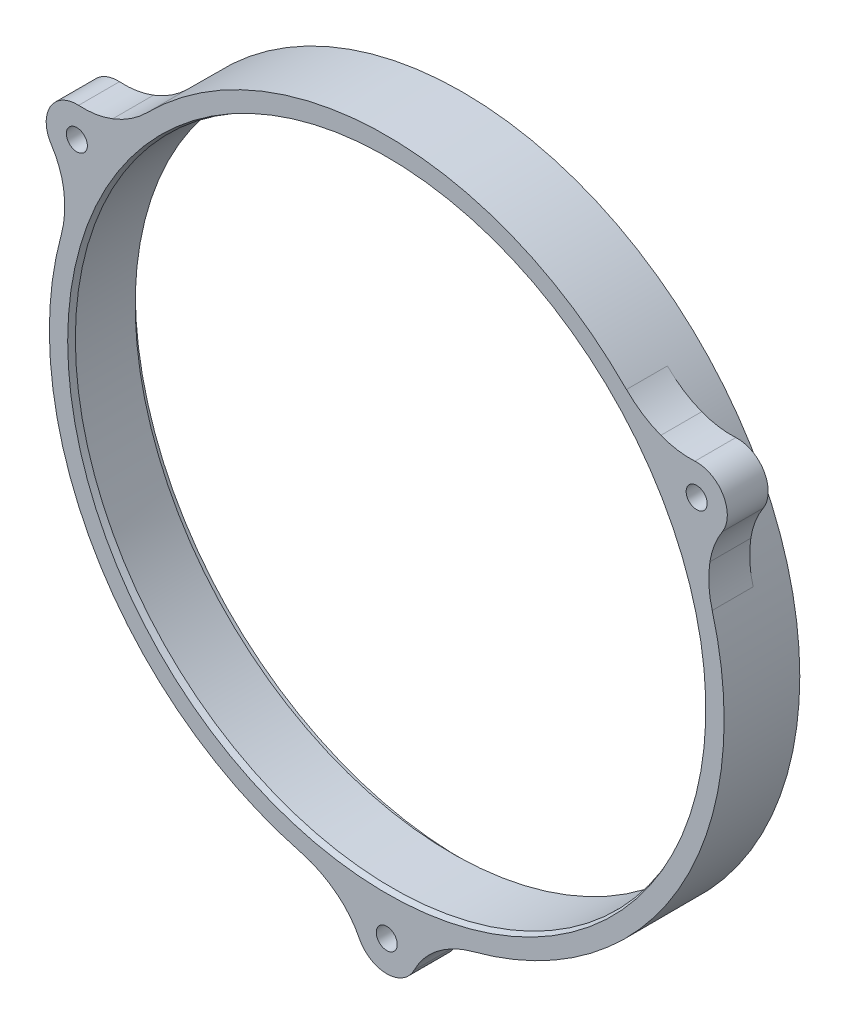
ISO-10303-21;
HEADER;
FILE_DESCRIPTION(('STEP AP214'),'2;1');
FILE_NAME('part.step','',(''),(''),'','','');
FILE_SCHEMA(('AUTOMOTIVE_DESIGN { 1 0 10303 214 1 1 1 1 }'));
ENDSEC;
DATA;
#1=APPLICATION_CONTEXT('core data for automotive mechanical design processes');
#2=APPLICATION_PROTOCOL_DEFINITION('international standard','automotive_design',2000,#1);
#3=PRODUCT_CONTEXT('',#1,'mechanical');
#4=PRODUCT('Part','Part','',(#3));
#5=PRODUCT_RELATED_PRODUCT_CATEGORY('part','',(#4));
#6=PRODUCT_DEFINITION_FORMATION('','',#4);
#7=PRODUCT_DEFINITION_CONTEXT('part definition',#1,'design');
#8=PRODUCT_DEFINITION('design','',#6,#7);
#9=PRODUCT_DEFINITION_SHAPE('','',#8);
#10=(LENGTH_UNIT() NAMED_UNIT(*) SI_UNIT(.MILLI.,.METRE.));
#11=(NAMED_UNIT(*) PLANE_ANGLE_UNIT() SI_UNIT($,.RADIAN.));
#12=(NAMED_UNIT(*) SI_UNIT($,.STERADIAN.) SOLID_ANGLE_UNIT());
#13=UNCERTAINTY_MEASURE_WITH_UNIT(LENGTH_MEASURE(1.E-05),#10,'distance_accuracy_value','');
#14=(GEOMETRIC_REPRESENTATION_CONTEXT(3) GLOBAL_UNCERTAINTY_ASSIGNED_CONTEXT((#13)) GLOBAL_UNIT_ASSIGNED_CONTEXT((#10,
#11,#12)) REPRESENTATION_CONTEXT('',''));
#15=CARTESIAN_POINT('',(0.,0.,0.));
#16=DIRECTION('',(0.,0.,1.));
#17=DIRECTION('',(1.,0.,0.));
#18=AXIS2_PLACEMENT_3D('',#15,#16,#17);
#19=CARTESIAN_POINT('',(0.,98.4504,0.));
#20=DIRECTION('',(0.,0.,-1.));
#21=DIRECTION('',(-1.,0.,0.));
#22=AXIS2_PLACEMENT_3D('',#19,#20,#21);
#23=PLANE('',#22);
#24=CARTESIAN_POINT('',(0.,0.,0.));
#25=DIRECTION('',(0.,0.,-1.));
#26=DIRECTION('',(-1.,0.,0.));
#27=AXIS2_PLACEMENT_3D('',#24,#25,#26);
#28=CIRCLE('',#27,99.0854);
#29=CARTESIAN_POINT('',(-99.0854,0.,0.));
#30=VERTEX_POINT('',#29);
#31=EDGE_CURVE('E11',#30,#30,#28,.T.);
#32=ORIENTED_EDGE('',*,*,#31,.T.);
#33=EDGE_LOOP('',(#32));
#34=FACE_BOUND('',#33,.T.);
#35=CARTESIAN_POINT('',(0.,-111.125,0.));
#36=DIRECTION('',(0.,0.,1.));
#37=DIRECTION('',(1.,0.,0.));
#38=AXIS2_PLACEMENT_3D('',#35,#36,#37);
#39=CIRCLE('',#38,3.2639);
#40=CARTESIAN_POINT('',(3.2639,-111.125,0.));
#41=VERTEX_POINT('',#40);
#42=EDGE_CURVE('E310',#41,#41,#39,.T.);
#43=ORIENTED_EDGE('',*,*,#42,.F.);
#44=EDGE_LOOP('',(#43));
#45=FACE_BOUND('',#44,.T.);
#46=CARTESIAN_POINT('',(-96.2370729955455,55.5625000000004,0.));
#47=DIRECTION('',(0.,0.,1.));
#48=DIRECTION('',(1.,0.,0.));
#49=AXIS2_PLACEMENT_3D('',#46,#47,#48);
#50=CIRCLE('',#49,3.2639);
#51=CARTESIAN_POINT('',(-92.9731729955455,55.5625000000004,0.));
#52=VERTEX_POINT('',#51);
#53=EDGE_CURVE('E231',#52,#52,#50,.T.);
#54=ORIENTED_EDGE('',*,*,#53,.F.);
#55=EDGE_LOOP('',(#54));
#56=FACE_BOUND('',#55,.T.);
#57=CARTESIAN_POINT('',(0.,0.,0.));
#58=DIRECTION('',(0.,0.,1.));
#59=DIRECTION('',(1.,0.,0.));
#60=AXIS2_PLACEMENT_3D('',#57,#58,#59);
#61=CIRCLE('',#60,104.775);
#62=CARTESIAN_POINT('',(-101.071009975213,27.6125255561757,0.));
#63=VERTEX_POINT('',#62);
#64=CARTESIAN_POINT('',(-26.6223563933117,-101.336325002772,0.));
#65=VERTEX_POINT('',#64);
#66=EDGE_CURVE('E302',#63,#65,#61,.T.);
#67=ORIENTED_EDGE('',*,*,#66,.T.);
#68=CARTESIAN_POINT('',(-34.3670418895478,-130.815983185397,0.));
#69=DIRECTION('',(0.,0.,-1.));
#70=DIRECTION('',(-0.500000000000004,0.866025403784436,0.));
#71=AXIS2_PLACEMENT_3D('',#68,#69,#70);
#72=CIRCLE('',#71,30.48);
#73=CARTESIAN_POINT('',(-15.24,-107.084428905167,0.));
#74=VERTEX_POINT('',#73);
#75=EDGE_CURVE('E219',#65,#74,#72,.T.);
#76=ORIENTED_EDGE('',*,*,#75,.T.);
#77=CARTESIAN_POINT('',(-31.1792015746232,-126.860724138692,0.));
#78=DIRECTION('',(0.,0.,-1.));
#79=DIRECTION('',(0.500000000000004,-0.866025403784436,0.));
#80=AXIS2_PLACEMENT_3D('',#77,#78,#79);
#81=CIRCLE('',#80,25.4);
#82=CARTESIAN_POINT('',(-8.50341861126089,-115.416561128734,0.));
#83=VERTEX_POINT('',#82);
#84=EDGE_CURVE('E222',#74,#83,#81,.T.);
#85=ORIENTED_EDGE('',*,*,#84,.T.);
#86=CARTESIAN_POINT('',(0.,-111.125,0.));
#87=DIRECTION('',(0.,0.,1.));
#88=DIRECTION('',(-0.500000000000004,0.866025403784436,0.));
#89=AXIS2_PLACEMENT_3D('',#86,#87,#88);
#90=CIRCLE('',#89,9.525);
#91=CARTESIAN_POINT('',(8.50341861126084,-115.416561128734,0.));
#92=VERTEX_POINT('',#91);
#93=EDGE_CURVE('E225',#83,#92,#90,.T.);
#94=ORIENTED_EDGE('',*,*,#93,.T.);
#95=CARTESIAN_POINT('',(31.1792015746231,-126.860724138692,0.));
#96=DIRECTION('',(0.,0.,-1.));
#97=DIRECTION('',(-0.500000000000004,0.866025403784436,0.));
#98=AXIS2_PLACEMENT_3D('',#95,#96,#97);
#99=CIRCLE('',#98,25.4);
#100=CARTESIAN_POINT('',(15.24,-107.084428905167,0.));
#101=VERTEX_POINT('',#100);
#102=EDGE_CURVE('E202',#92,#101,#99,.T.);
#103=ORIENTED_EDGE('',*,*,#102,.T.);
#104=CARTESIAN_POINT('',(34.3670418895478,-130.815983185397,0.));
#105=DIRECTION('',(0.,0.,-1.));
#106=DIRECTION('',(0.500000000000004,-0.866025403784436,0.));
#107=AXIS2_PLACEMENT_3D('',#104,#105,#106);
#108=CIRCLE('',#107,30.48);
#109=CARTESIAN_POINT('',(26.6223563933116,-101.336325002772,0.));
#110=VERTEX_POINT('',#109);
#111=EDGE_CURVE('E60',#101,#110,#108,.T.);
#112=ORIENTED_EDGE('',*,*,#111,.T.);
#113=CARTESIAN_POINT('',(101.071009975213,27.6125255561757,0.));
#114=VERTEX_POINT('',#113);
#115=EDGE_CURVE('E305',#110,#114,#61,.T.);
#116=ORIENTED_EDGE('',*,*,#115,.T.);
#117=CARTESIAN_POINT('',(130.473485604366,35.6452602634267,0.));
#118=DIRECTION('',(0.,0.,-1.));
#119=DIRECTION('',(-0.499999999999992,-0.866025403784443,0.));
#120=AXIS2_PLACEMENT_3D('',#117,#118,#119);
#121=CIRCLE('',#120,30.48);
#122=CARTESIAN_POINT('',(100.357835781623,40.3439872989093,0.));
#123=VERTEX_POINT('',#122);
#124=EDGE_CURVE('E445',#114,#123,#121,.T.);
#125=ORIENTED_EDGE('',*,*,#124,.T.);
#126=CARTESIAN_POINT('',(125.454210633908,36.4283814360072,0.));
#127=DIRECTION('',(0.,0.,-1.));
#128=DIRECTION('',(0.499999999999992,0.866025403784443,0.));
#129=AXIS2_PLACEMENT_3D('',#126,#127,#128);
#130=CIRCLE('',#129,25.4);
#131=CARTESIAN_POINT('',(104.205383260554,50.3441040280023,0.));
#132=VERTEX_POINT('',#131);
#133=EDGE_CURVE('E448',#123,#132,#130,.T.);
#134=ORIENTED_EDGE('',*,*,#133,.T.);
#135=CARTESIAN_POINT('',(96.2370729955455,55.5625000000004,0.));
#136=DIRECTION('',(0.,0.,1.));
#137=DIRECTION('',(-0.499999999999992,-0.866025403784443,0.));
#138=AXIS2_PLACEMENT_3D('',#135,#136,#137);
#139=CIRCLE('',#138,9.525);
#140=CARTESIAN_POINT('',(95.7019646492927,65.0724571007328,0.));
#141=VERTEX_POINT('',#140);
#142=EDGE_CURVE('E451',#132,#141,#139,.T.);
#143=ORIENTED_EDGE('',*,*,#142,.T.);
#144=CARTESIAN_POINT('',(94.2750090592851,90.4323427026859,0.));
#145=DIRECTION('',(0.,0.,-1.));
#146=DIRECTION('',(-0.499999999999992,-0.866025403784443,0.));
#147=AXIS2_PLACEMENT_3D('',#144,#145,#146);
#148=CIRCLE('',#147,25.4);
#149=CARTESIAN_POINT('',(85.1178357816233,66.7404416062589,0.));
#150=VERTEX_POINT('',#149);
#151=EDGE_CURVE('E184',#141,#150,#148,.T.);
#152=ORIENTED_EDGE('',*,*,#151,.T.);
#153=CARTESIAN_POINT('',(96.1064437148175,95.1707229219713,0.));
#154=DIRECTION('',(0.,0.,-1.));
#155=DIRECTION('',(0.499999999999992,0.866025403784443,0.));
#156=AXIS2_PLACEMENT_3D('',#153,#154,#155);
#157=CIRCLE('',#156,30.48);
#158=CARTESIAN_POINT('',(74.4486535819009,73.7237994465974,0.));
#159=VERTEX_POINT('',#158);
#160=EDGE_CURVE('E53',#150,#159,#157,.T.);
#161=ORIENTED_EDGE('',*,*,#160,.T.);
#162=CARTESIAN_POINT('',(-74.4486535819008,73.7237994465975,0.));
#163=VERTEX_POINT('',#162);
#164=EDGE_CURVE('E188',#159,#163,#61,.T.);
#165=ORIENTED_EDGE('',*,*,#164,.T.);
#166=CARTESIAN_POINT('',(-96.1064437148174,95.1707229219713,0.));
#167=DIRECTION('',(0.,0.,-1.));
#168=DIRECTION('',(1.,0.,0.));
#169=AXIS2_PLACEMENT_3D('',#166,#167,#168);
#170=CIRCLE('',#169,30.48);
#171=CARTESIAN_POINT('',(-85.1178357816233,66.740441606259,0.));
#172=VERTEX_POINT('',#171);
#173=EDGE_CURVE('E267',#163,#172,#170,.T.);
#174=ORIENTED_EDGE('',*,*,#173,.T.);
#175=CARTESIAN_POINT('',(-94.2750090592851,90.4323427026859,0.));
#176=DIRECTION('',(0.,0.,-1.));
#177=DIRECTION('',(-1.,0.,0.));
#178=AXIS2_PLACEMENT_3D('',#175,#176,#177);
#179=CIRCLE('',#178,25.4);
#180=CARTESIAN_POINT('',(-95.7019646492926,65.0724571007329,0.));
#181=VERTEX_POINT('',#180);
#182=EDGE_CURVE('E270',#172,#181,#179,.T.);
#183=ORIENTED_EDGE('',*,*,#182,.T.);
#184=CARTESIAN_POINT('',(-96.2370729955455,55.5625000000005,0.));
#185=DIRECTION('',(0.,0.,1.));
#186=DIRECTION('',(1.,0.,0.));
#187=AXIS2_PLACEMENT_3D('',#184,#185,#186);
#188=CIRCLE('',#187,9.525);
#189=CARTESIAN_POINT('',(-104.205383260554,50.3441040280023,0.));
#190=VERTEX_POINT('',#189);
#191=EDGE_CURVE('E273',#181,#190,#188,.T.);
#192=ORIENTED_EDGE('',*,*,#191,.T.);
#193=CARTESIAN_POINT('',(-125.454210633908,36.4283814360072,0.));
#194=DIRECTION('',(0.,0.,-1.));
#195=DIRECTION('',(1.,0.,0.));
#196=AXIS2_PLACEMENT_3D('',#193,#194,#195);
#197=CIRCLE('',#196,25.4);
#198=CARTESIAN_POINT('',(-100.357835781623,40.3439872989094,0.));
#199=VERTEX_POINT('',#198);
#200=EDGE_CURVE('E249',#190,#199,#197,.T.);
#201=ORIENTED_EDGE('',*,*,#200,.T.);
#202=CARTESIAN_POINT('',(-130.473485604366,35.6452602634268,0.));
#203=DIRECTION('',(0.,0.,-1.));
#204=DIRECTION('',(-1.,0.,0.));
#205=AXIS2_PLACEMENT_3D('',#202,#203,#204);
#206=CIRCLE('',#205,30.48);
#207=EDGE_CURVE('E265',#199,#63,#206,.T.);
#208=ORIENTED_EDGE('',*,*,#207,.T.);
#209=EDGE_LOOP('',(#67,#76,#85,#94,#103,#112,#116,#125,#134,#143,#152,#161,#165,#174,#183,#192,
#201,#208));
#210=FACE_BOUND('',#209,.T.);
#211=CARTESIAN_POINT('',(96.2370729955455,55.5625000000004,0.));
#212=DIRECTION('',(0.,0.,1.));
#213=DIRECTION('',(1.,0.,0.));
#214=AXIS2_PLACEMENT_3D('',#211,#212,#213);
#215=CIRCLE('',#214,3.2639);
#216=CARTESIAN_POINT('',(99.5009729955455,55.5625000000004,0.));
#217=VERTEX_POINT('',#216);
#218=EDGE_CURVE('E311',#217,#217,#215,.T.);
#219=ORIENTED_EDGE('',*,*,#218,.F.);
#220=EDGE_LOOP('',(#219));
#221=FACE_BOUND('',#220,.T.);
#222=ADVANCED_FACE('F38',(#34,#45,#56,#210,#221),#23,.F.);
#223=CARTESIAN_POINT('',(0.,0.,0.));
#224=DIRECTION('',(0.,0.,1.));
#225=DIRECTION('',(1.,0.,0.));
#226=AXIS2_PLACEMENT_3D('',#223,#224,#225);
#227=CYLINDRICAL_SURFACE('',#226,104.775);
#228=CARTESIAN_POINT('',(0.,0.,-23.495));
#229=DIRECTION('',(0.,0.,1.));
#230=DIRECTION('',(1.,0.,0.));
#231=AXIS2_PLACEMENT_3D('',#228,#229,#230);
#232=CIRCLE('',#231,104.775);
#233=CARTESIAN_POINT('',(104.775,0.,-23.495));
#234=VERTEX_POINT('',#233);
#235=EDGE_CURVE('E299',#234,#234,#232,.T.);
#236=ORIENTED_EDGE('',*,*,#235,.T.);
#237=EDGE_LOOP('',(#236));
#238=FACE_BOUND('',#237,.T.);
#239=DIRECTION('',(0.,0.,1.));
#240=VECTOR('',#239,1.);
#241=CARTESIAN_POINT('',(74.4486535819009,73.7237994465975,-12.7));
#242=LINE('',#241,#240);
#243=CARTESIAN_POINT('',(74.4486535819009,73.7237994465975,-12.7));
#244=VERTEX_POINT('',#243);
#245=EDGE_CURVE('E181',#244,#159,#242,.T.);
#246=ORIENTED_EDGE('',*,*,#245,.F.);
#247=CARTESIAN_POINT('',(0.,0.,-12.7));
#248=DIRECTION('',(0.,0.,-1.));
#249=DIRECTION('',(-0.499999999999992,-0.866025403784443,0.));
#250=AXIS2_PLACEMENT_3D('',#247,#248,#249);
#251=CIRCLE('',#250,104.775);
#252=CARTESIAN_POINT('',(101.071009975213,27.6125255561757,-12.7));
#253=VERTEX_POINT('',#252);
#254=EDGE_CURVE('E166',#244,#253,#251,.T.);
#255=ORIENTED_EDGE('',*,*,#254,.T.);
#256=DIRECTION('',(0.,0.,1.));
#257=VECTOR('',#256,1.);
#258=CARTESIAN_POINT('',(101.071009975213,27.6125255561757,-12.7));
#259=LINE('',#258,#257);
#260=EDGE_CURVE('E189',#253,#114,#259,.T.);
#261=ORIENTED_EDGE('',*,*,#260,.T.);
#262=ORIENTED_EDGE('',*,*,#115,.F.);
#263=DIRECTION('',(0.,0.,1.));
#264=VECTOR('',#263,1.);
#265=CARTESIAN_POINT('',(26.6223563933117,-101.336325002772,-12.7));
#266=LINE('',#265,#264);
#267=CARTESIAN_POINT('',(26.6223563933117,-101.336325002772,-12.7));
#268=VERTEX_POINT('',#267);
#269=EDGE_CURVE('E217',#268,#110,#266,.T.);
#270=ORIENTED_EDGE('',*,*,#269,.F.);
#271=CARTESIAN_POINT('',(0.,0.,-12.7));
#272=DIRECTION('',(0.,0.,-1.));
#273=DIRECTION('',(-0.500000000000004,0.866025403784436,0.));
#274=AXIS2_PLACEMENT_3D('',#271,#272,#273);
#275=CIRCLE('',#274,104.775);
#276=CARTESIAN_POINT('',(-26.6223563933117,-101.336325002772,-12.7));
#277=VERTEX_POINT('',#276);
#278=EDGE_CURVE('E201',#268,#277,#275,.T.);
#279=ORIENTED_EDGE('',*,*,#278,.T.);
#280=DIRECTION('',(0.,0.,1.));
#281=VECTOR('',#280,1.);
#282=CARTESIAN_POINT('',(-26.6223563933117,-101.336325002772,-12.7));
#283=LINE('',#282,#281);
#284=EDGE_CURVE('E238',#277,#65,#283,.T.);
#285=ORIENTED_EDGE('',*,*,#284,.T.);
#286=ORIENTED_EDGE('',*,*,#66,.F.);
#287=DIRECTION('',(0.,0.,1.));
#288=VECTOR('',#287,1.);
#289=CARTESIAN_POINT('',(-101.071009975213,27.6125255561757,-12.7));
#290=LINE('',#289,#288);
#291=CARTESIAN_POINT('',(-101.071009975213,27.6125255561757,-12.7));
#292=VERTEX_POINT('',#291);
#293=EDGE_CURVE('E264',#292,#63,#290,.T.);
#294=ORIENTED_EDGE('',*,*,#293,.F.);
#295=CARTESIAN_POINT('',(0.,0.,-12.7));
#296=DIRECTION('',(0.,0.,-1.));
#297=DIRECTION('',(1.,0.,0.));
#298=AXIS2_PLACEMENT_3D('',#295,#296,#297);
#299=CIRCLE('',#298,104.775);
#300=CARTESIAN_POINT('',(-74.4486535819008,73.7237994465975,-12.7));
#301=VERTEX_POINT('',#300);
#302=EDGE_CURVE('E248',#292,#301,#299,.T.);
#303=ORIENTED_EDGE('',*,*,#302,.T.);
#304=DIRECTION('',(0.,0.,1.));
#305=VECTOR('',#304,1.);
#306=CARTESIAN_POINT('',(-74.4486535819008,73.7237994465975,-12.7));
#307=LINE('',#306,#305);
#308=EDGE_CURVE('E287',#301,#163,#307,.T.);
#309=ORIENTED_EDGE('',*,*,#308,.T.);
#310=ORIENTED_EDGE('',*,*,#164,.F.);
#311=EDGE_LOOP('',(#246,#255,#261,#262,#270,#279,#285,#286,#294,#303,#309,#310));
#312=FACE_BOUND('',#311,.T.);
#313=ADVANCED_FACE('F186',(#238,#312),#227,.T.);
#314=CARTESIAN_POINT('',(0.,104.775,-23.495));
#315=DIRECTION('',(0.,0.,1.));
#316=DIRECTION('',(1.,0.,0.));
#317=AXIS2_PLACEMENT_3D('',#314,#315,#316);
#318=PLANE('',#317);
#319=ORIENTED_EDGE('',*,*,#235,.F.);
#320=EDGE_LOOP('',(#319));
#321=FACE_BOUND('',#320,.T.);
#322=CARTESIAN_POINT('',(0.,0.,-23.495));
#323=DIRECTION('',(0.,0.,1.));
#324=DIRECTION('',(1.,0.,0.));
#325=AXIS2_PLACEMENT_3D('',#322,#323,#324);
#326=CIRCLE('',#325,101.6);
#327=CARTESIAN_POINT('',(101.6,0.,-23.495));
#328=VERTEX_POINT('',#327);
#329=EDGE_CURVE('E296',#328,#328,#326,.T.);
#330=ORIENTED_EDGE('',*,*,#329,.T.);
#331=EDGE_LOOP('',(#330));
#332=FACE_BOUND('',#331,.T.);
#333=ADVANCED_FACE('F333',(#321,#332),#318,.F.);
#334=CARTESIAN_POINT('',(0.,0.,0.));
#335=DIRECTION('',(0.,0.,1.));
#336=DIRECTION('',(1.,0.,0.));
#337=AXIS2_PLACEMENT_3D('',#334,#335,#336);
#338=CYLINDRICAL_SURFACE('',#337,101.6);
#339=ORIENTED_EDGE('',*,*,#329,.F.);
#340=EDGE_LOOP('',(#339));
#341=FACE_BOUND('',#340,.T.);
#342=CARTESIAN_POINT('',(0.,0.,-20.32));
#343=DIRECTION('',(0.,0.,1.));
#344=DIRECTION('',(1.,0.,0.));
#345=AXIS2_PLACEMENT_3D('',#342,#343,#344);
#346=CIRCLE('',#345,101.6);
#347=CARTESIAN_POINT('',(101.6,0.,-20.32));
#348=VERTEX_POINT('',#347);
#349=EDGE_CURVE('E293',#348,#348,#346,.T.);
#350=ORIENTED_EDGE('',*,*,#349,.T.);
#351=EDGE_LOOP('',(#350));
#352=FACE_BOUND('',#351,.T.);
#353=ADVANCED_FACE('F340',(#341,#352),#338,.F.);
#354=CARTESIAN_POINT('',(0.,101.6,-20.32));
#355=DIRECTION('',(0.,0.,1.));
#356=DIRECTION('',(1.,0.,0.));
#357=AXIS2_PLACEMENT_3D('',#354,#355,#356);
#358=PLANE('',#357);
#359=ORIENTED_EDGE('',*,*,#349,.F.);
#360=EDGE_LOOP('',(#359));
#361=FACE_BOUND('',#360,.T.);
#362=CARTESIAN_POINT('',(0.,0.,-20.32));
#363=DIRECTION('',(0.,0.,1.));
#364=DIRECTION('',(1.,0.,0.));
#365=AXIS2_PLACEMENT_3D('',#362,#363,#364);
#366=CIRCLE('',#365,98.4504);
#367=CARTESIAN_POINT('',(98.4504,0.,-20.32));
#368=VERTEX_POINT('',#367);
#369=EDGE_CURVE('E280',#368,#368,#366,.T.);
#370=ORIENTED_EDGE('',*,*,#369,.T.);
#371=EDGE_LOOP('',(#370));
#372=FACE_BOUND('',#371,.T.);
#373=ADVANCED_FACE('F344',(#361,#372),#358,.F.);
#374=CARTESIAN_POINT('',(0.,0.,0.));
#375=DIRECTION('',(0.,0.,1.));
#376=DIRECTION('',(1.,0.,0.));
#377=AXIS2_PLACEMENT_3D('',#374,#375,#376);
#378=CYLINDRICAL_SURFACE('',#377,98.4504);
#379=CARTESIAN_POINT('',(0.,0.,-1.74464816135378));
#380=DIRECTION('',(0.,0.,-1.));
#381=DIRECTION('',(-1.,0.,0.));
#382=AXIS2_PLACEMENT_3D('',#379,#380,#381);
#383=CIRCLE('',#382,98.4504);
#384=CARTESIAN_POINT('',(-98.4504,0.,-1.74464816135378));
#385=VERTEX_POINT('',#384);
#386=EDGE_CURVE('E46',#385,#385,#383,.F.);
#387=ORIENTED_EDGE('',*,*,#386,.T.);
#388=EDGE_LOOP('',(#387));
#389=FACE_BOUND('',#388,.T.);
#390=ORIENTED_EDGE('',*,*,#369,.F.);
#391=EDGE_LOOP('',(#390));
#392=FACE_BOUND('',#391,.T.);
#393=ADVANCED_FACE('F315',(#389,#392),#378,.F.);
#394=CARTESIAN_POINT('',(-130.473485604366,35.6452602634268,-12.7));
#395=DIRECTION('',(0.,0.,1.));
#396=DIRECTION('',(1.,0.,0.));
#397=AXIS2_PLACEMENT_3D('',#394,#395,#396);
#398=CYLINDRICAL_SURFACE('',#397,30.48);
#399=ORIENTED_EDGE('',*,*,#207,.F.);
#400=DIRECTION('',(0.,0.,1.));
#401=VECTOR('',#400,1.);
#402=CARTESIAN_POINT('',(-100.357835781623,40.3439872989094,-12.7));
#403=LINE('',#402,#401);
#404=CARTESIAN_POINT('',(-100.357835781623,40.3439872989094,-12.7));
#405=VERTEX_POINT('',#404);
#406=EDGE_CURVE('E278',#405,#199,#403,.T.);
#407=ORIENTED_EDGE('',*,*,#406,.F.);
#408=CARTESIAN_POINT('',(-130.473485604366,35.6452602634268,-12.7));
#409=DIRECTION('',(0.,0.,-1.));
#410=DIRECTION('',(-1.,0.,0.));
#411=AXIS2_PLACEMENT_3D('',#408,#409,#410);
#412=CIRCLE('',#411,30.48);
#413=EDGE_CURVE('E245',#405,#292,#412,.T.);
#414=ORIENTED_EDGE('',*,*,#413,.T.);
#415=ORIENTED_EDGE('',*,*,#293,.T.);
#416=EDGE_LOOP('',(#399,#407,#414,#415));
#417=FACE_BOUND('',#416,.T.);
#418=ADVANCED_FACE('F351',(#417),#398,.F.);
#419=CARTESIAN_POINT('',(-125.454210633908,36.4283814360072,-12.7));
#420=DIRECTION('',(0.,0.,1.));
#421=DIRECTION('',(1.,0.,0.));
#422=AXIS2_PLACEMENT_3D('',#419,#420,#421);
#423=CYLINDRICAL_SURFACE('',#422,25.4);
#424=ORIENTED_EDGE('',*,*,#200,.F.);
#425=DIRECTION('',(0.,0.,1.));
#426=VECTOR('',#425,1.);
#427=CARTESIAN_POINT('',(-104.205383260554,50.3441040280023,-12.7));
#428=LINE('',#427,#426);
#429=CARTESIAN_POINT('',(-104.205383260554,50.3441040280023,-12.7));
#430=VERTEX_POINT('',#429);
#431=EDGE_CURVE('E281',#430,#190,#428,.T.);
#432=ORIENTED_EDGE('',*,*,#431,.F.);
#433=CARTESIAN_POINT('',(-125.454210633908,36.4283814360072,-12.7));
#434=DIRECTION('',(0.,0.,-1.));
#435=DIRECTION('',(1.,0.,0.));
#436=AXIS2_PLACEMENT_3D('',#433,#434,#435);
#437=CIRCLE('',#436,25.4);
#438=EDGE_CURVE('E261',#430,#405,#437,.T.);
#439=ORIENTED_EDGE('',*,*,#438,.T.);
#440=ORIENTED_EDGE('',*,*,#406,.T.);
#441=EDGE_LOOP('',(#424,#432,#439,#440));
#442=FACE_BOUND('',#441,.T.);
#443=ADVANCED_FACE('F354',(#442),#423,.F.);
#444=CARTESIAN_POINT('',(-96.2370729955455,55.5625000000005,-12.7));
#445=DIRECTION('',(0.,0.,1.));
#446=DIRECTION('',(1.,0.,0.));
#447=AXIS2_PLACEMENT_3D('',#444,#445,#446);
#448=CYLINDRICAL_SURFACE('',#447,9.525);
#449=ORIENTED_EDGE('',*,*,#191,.F.);
#450=DIRECTION('',(0.,0.,1.));
#451=VECTOR('',#450,1.);
#452=CARTESIAN_POINT('',(-95.7019646492926,65.0724571007329,-12.7));
#453=LINE('',#452,#451);
#454=CARTESIAN_POINT('',(-95.7019646492926,65.0724571007329,-12.7));
#455=VERTEX_POINT('',#454);
#456=EDGE_CURVE('E283',#455,#181,#453,.T.);
#457=ORIENTED_EDGE('',*,*,#456,.F.);
#458=CARTESIAN_POINT('',(-96.2370729955455,55.5625000000005,-12.7));
#459=DIRECTION('',(0.,0.,1.));
#460=DIRECTION('',(1.,0.,0.));
#461=AXIS2_PLACEMENT_3D('',#458,#459,#460);
#462=CIRCLE('',#461,9.525);
#463=EDGE_CURVE('E258',#455,#430,#462,.T.);
#464=ORIENTED_EDGE('',*,*,#463,.T.);
#465=ORIENTED_EDGE('',*,*,#431,.T.);
#466=EDGE_LOOP('',(#449,#457,#464,#465));
#467=FACE_BOUND('',#466,.T.);
#468=ADVANCED_FACE('F364',(#467),#448,.T.);
#469=CARTESIAN_POINT('',(-94.2750090592851,90.4323427026859,-12.7));
#470=DIRECTION('',(0.,0.,1.));
#471=DIRECTION('',(1.,0.,0.));
#472=AXIS2_PLACEMENT_3D('',#469,#470,#471);
#473=CYLINDRICAL_SURFACE('',#472,25.4);
#474=ORIENTED_EDGE('',*,*,#182,.F.);
#475=DIRECTION('',(0.,0.,1.));
#476=VECTOR('',#475,1.);
#477=CARTESIAN_POINT('',(-85.1178357816233,66.740441606259,-12.7));
#478=LINE('',#477,#476);
#479=CARTESIAN_POINT('',(-85.1178357816233,66.740441606259,-12.7));
#480=VERTEX_POINT('',#479);
#481=EDGE_CURVE('E285',#480,#172,#478,.T.);
#482=ORIENTED_EDGE('',*,*,#481,.F.);
#483=CARTESIAN_POINT('',(-94.2750090592851,90.4323427026859,-12.7));
#484=DIRECTION('',(0.,0.,-1.));
#485=DIRECTION('',(-1.,0.,0.));
#486=AXIS2_PLACEMENT_3D('',#483,#484,#485);
#487=CIRCLE('',#486,25.4);
#488=EDGE_CURVE('E255',#480,#455,#487,.T.);
#489=ORIENTED_EDGE('',*,*,#488,.T.);
#490=ORIENTED_EDGE('',*,*,#456,.T.);
#491=EDGE_LOOP('',(#474,#482,#489,#490));
#492=FACE_BOUND('',#491,.T.);
#493=ADVANCED_FACE('F360',(#492),#473,.F.);
#494=CARTESIAN_POINT('',(-96.1064437148174,95.1707229219713,-12.7));
#495=DIRECTION('',(0.,0.,1.));
#496=DIRECTION('',(1.,0.,0.));
#497=AXIS2_PLACEMENT_3D('',#494,#495,#496);
#498=CYLINDRICAL_SURFACE('',#497,30.48);
#499=ORIENTED_EDGE('',*,*,#173,.F.);
#500=ORIENTED_EDGE('',*,*,#308,.F.);
#501=CARTESIAN_POINT('',(-96.1064437148174,95.1707229219713,-12.7));
#502=DIRECTION('',(0.,0.,-1.));
#503=DIRECTION('',(1.,0.,0.));
#504=AXIS2_PLACEMENT_3D('',#501,#502,#503);
#505=CIRCLE('',#504,30.48);
#506=EDGE_CURVE('E252',#301,#480,#505,.T.);
#507=ORIENTED_EDGE('',*,*,#506,.T.);
#508=ORIENTED_EDGE('',*,*,#481,.T.);
#509=EDGE_LOOP('',(#499,#500,#507,#508));
#510=FACE_BOUND('',#509,.T.);
#511=ADVANCED_FACE('F356',(#510),#498,.F.);
#512=CARTESIAN_POINT('',(-65.2367428021827,17.8226301317134,-12.7));
#513=DIRECTION('',(0.,0.,-1.));
#514=DIRECTION('',(-1.,0.,0.));
#515=AXIS2_PLACEMENT_3D('',#512,#513,#514);
#516=PLANE('',#515);
#517=CARTESIAN_POINT('',(-96.2370729955455,55.5625000000004,-12.7));
#518=DIRECTION('',(0.,0.,-1.));
#519=DIRECTION('',(-1.,0.,0.));
#520=AXIS2_PLACEMENT_3D('',#517,#518,#519);
#521=CIRCLE('',#520,3.2639);
#522=CARTESIAN_POINT('',(-99.5009729955455,55.5625000000004,-12.7));
#523=VERTEX_POINT('',#522);
#524=EDGE_CURVE('E244',#523,#523,#521,.T.);
#525=ORIENTED_EDGE('',*,*,#524,.F.);
#526=EDGE_LOOP('',(#525));
#527=FACE_BOUND('',#526,.T.);
#528=ORIENTED_EDGE('',*,*,#413,.F.);
#529=ORIENTED_EDGE('',*,*,#438,.F.);
#530=ORIENTED_EDGE('',*,*,#463,.F.);
#531=ORIENTED_EDGE('',*,*,#488,.F.);
#532=ORIENTED_EDGE('',*,*,#506,.F.);
#533=ORIENTED_EDGE('',*,*,#302,.F.);
#534=EDGE_LOOP('',(#528,#529,#530,#531,#532,#533));
#535=FACE_BOUND('',#534,.T.);
#536=ADVANCED_FACE('F359',(#527,#535),#516,.T.);
#537=CARTESIAN_POINT('',(-96.2370729955455,55.5625000000004,0.));
#538=DIRECTION('',(0.,0.,1.));
#539=DIRECTION('',(1.,0.,0.));
#540=AXIS2_PLACEMENT_3D('',#537,#538,#539);
#541=CYLINDRICAL_SURFACE('',#540,3.2639);
#542=ORIENTED_EDGE('',*,*,#524,.T.);
#543=EDGE_LOOP('',(#542));
#544=FACE_BOUND('',#543,.T.);
#545=ORIENTED_EDGE('',*,*,#53,.T.);
#546=EDGE_LOOP('',(#545));
#547=FACE_BOUND('',#546,.T.);
#548=ADVANCED_FACE('F374',(#544,#547),#541,.F.);
#549=CARTESIAN_POINT('',(34.3670418895478,-130.815983185397,-12.7));
#550=DIRECTION('',(0.,0.,1.));
#551=DIRECTION('',(1.,0.,0.));
#552=AXIS2_PLACEMENT_3D('',#549,#550,#551);
#553=CYLINDRICAL_SURFACE('',#552,30.48);
#554=ORIENTED_EDGE('',*,*,#111,.F.);
#555=DIRECTION('',(0.,0.,1.));
#556=VECTOR('',#555,1.);
#557=CARTESIAN_POINT('',(15.24,-107.084428905167,-12.7));
#558=LINE('',#557,#556);
#559=CARTESIAN_POINT('',(15.24,-107.084428905167,-12.7));
#560=VERTEX_POINT('',#559);
#561=EDGE_CURVE('E229',#560,#101,#558,.T.);
#562=ORIENTED_EDGE('',*,*,#561,.F.);
#563=CARTESIAN_POINT('',(34.3670418895478,-130.815983185397,-12.7));
#564=DIRECTION('',(0.,0.,-1.));
#565=DIRECTION('',(0.500000000000004,-0.866025403784436,0.));
#566=AXIS2_PLACEMENT_3D('',#563,#564,#565);
#567=CIRCLE('',#566,30.48);
#568=EDGE_CURVE('E198',#560,#268,#567,.T.);
#569=ORIENTED_EDGE('',*,*,#568,.T.);
#570=ORIENTED_EDGE('',*,*,#269,.T.);
#571=EDGE_LOOP('',(#554,#562,#569,#570));
#572=FACE_BOUND('',#571,.T.);
#573=ADVANCED_FACE('F378',(#572),#553,.F.);
#574=CARTESIAN_POINT('',(31.1792015746231,-126.860724138692,-12.7));
#575=DIRECTION('',(0.,0.,1.));
#576=DIRECTION('',(1.,0.,0.));
#577=AXIS2_PLACEMENT_3D('',#574,#575,#576);
#578=CYLINDRICAL_SURFACE('',#577,25.4);
#579=ORIENTED_EDGE('',*,*,#102,.F.);
#580=DIRECTION('',(0.,0.,1.));
#581=VECTOR('',#580,1.);
#582=CARTESIAN_POINT('',(8.50341861126084,-115.416561128734,-12.7));
#583=LINE('',#582,#581);
#584=CARTESIAN_POINT('',(8.50341861126084,-115.416561128734,-12.7));
#585=VERTEX_POINT('',#584);
#586=EDGE_CURVE('E232',#585,#92,#583,.T.);
#587=ORIENTED_EDGE('',*,*,#586,.F.);
#588=CARTESIAN_POINT('',(31.1792015746231,-126.860724138692,-12.7));
#589=DIRECTION('',(0.,0.,-1.));
#590=DIRECTION('',(-0.500000000000004,0.866025403784436,0.));
#591=AXIS2_PLACEMENT_3D('',#588,#589,#590);
#592=CIRCLE('',#591,25.4);
#593=EDGE_CURVE('E214',#585,#560,#592,.T.);
#594=ORIENTED_EDGE('',*,*,#593,.T.);
#595=ORIENTED_EDGE('',*,*,#561,.T.);
#596=EDGE_LOOP('',(#579,#587,#594,#595));
#597=FACE_BOUND('',#596,.T.);
#598=ADVANCED_FACE('F382',(#597),#578,.F.);
#599=CARTESIAN_POINT('',(0.,-111.125,-12.7));
#600=DIRECTION('',(0.,0.,1.));
#601=DIRECTION('',(1.,0.,0.));
#602=AXIS2_PLACEMENT_3D('',#599,#600,#601);
#603=CYLINDRICAL_SURFACE('',#602,9.525);
#604=ORIENTED_EDGE('',*,*,#93,.F.);
#605=DIRECTION('',(0.,0.,1.));
#606=VECTOR('',#605,1.);
#607=CARTESIAN_POINT('',(-8.50341861126089,-115.416561128734,-12.7));
#608=LINE('',#607,#606);
#609=CARTESIAN_POINT('',(-8.50341861126089,-115.416561128734,-12.7));
#610=VERTEX_POINT('',#609);
#611=EDGE_CURVE('E234',#610,#83,#608,.T.);
#612=ORIENTED_EDGE('',*,*,#611,.F.);
#613=CARTESIAN_POINT('',(0.,-111.125,-12.7));
#614=DIRECTION('',(0.,0.,1.));
#615=DIRECTION('',(-0.500000000000004,0.866025403784436,0.));
#616=AXIS2_PLACEMENT_3D('',#613,#614,#615);
#617=CIRCLE('',#616,9.525);
#618=EDGE_CURVE('E211',#610,#585,#617,.T.);
#619=ORIENTED_EDGE('',*,*,#618,.T.);
#620=ORIENTED_EDGE('',*,*,#586,.T.);
#621=EDGE_LOOP('',(#604,#612,#619,#620));
#622=FACE_BOUND('',#621,.T.);
#623=ADVANCED_FACE('F392',(#622),#603,.T.);
#624=CARTESIAN_POINT('',(-31.1792015746232,-126.860724138692,-12.7));
#625=DIRECTION('',(0.,0.,1.));
#626=DIRECTION('',(1.,0.,0.));
#627=AXIS2_PLACEMENT_3D('',#624,#625,#626);
#628=CYLINDRICAL_SURFACE('',#627,25.4);
#629=ORIENTED_EDGE('',*,*,#84,.F.);
#630=DIRECTION('',(0.,0.,1.));
#631=VECTOR('',#630,1.);
#632=CARTESIAN_POINT('',(-15.24,-107.084428905167,-12.7));
#633=LINE('',#632,#631);
#634=CARTESIAN_POINT('',(-15.24,-107.084428905167,-12.7));
#635=VERTEX_POINT('',#634);
#636=EDGE_CURVE('E236',#635,#74,#633,.T.);
#637=ORIENTED_EDGE('',*,*,#636,.F.);
#638=CARTESIAN_POINT('',(-31.1792015746232,-126.860724138692,-12.7));
#639=DIRECTION('',(0.,0.,-1.));
#640=DIRECTION('',(0.500000000000004,-0.866025403784436,0.));
#641=AXIS2_PLACEMENT_3D('',#638,#639,#640);
#642=CIRCLE('',#641,25.4);
#643=EDGE_CURVE('E208',#635,#610,#642,.T.);
#644=ORIENTED_EDGE('',*,*,#643,.T.);
#645=ORIENTED_EDGE('',*,*,#611,.T.);
#646=EDGE_LOOP('',(#629,#637,#644,#645));
#647=FACE_BOUND('',#646,.T.);
#648=ADVANCED_FACE('F388',(#647),#628,.F.);
#649=CARTESIAN_POINT('',(-34.3670418895478,-130.815983185397,-12.7));
#650=DIRECTION('',(0.,0.,1.));
#651=DIRECTION('',(1.,0.,0.));
#652=AXIS2_PLACEMENT_3D('',#649,#650,#651);
#653=CYLINDRICAL_SURFACE('',#652,30.48);
#654=ORIENTED_EDGE('',*,*,#75,.F.);
#655=ORIENTED_EDGE('',*,*,#284,.F.);
#656=CARTESIAN_POINT('',(-34.3670418895478,-130.815983185397,-12.7));
#657=DIRECTION('',(0.,0.,-1.));
#658=DIRECTION('',(-0.500000000000004,0.866025403784436,0.));
#659=AXIS2_PLACEMENT_3D('',#656,#657,#658);
#660=CIRCLE('',#659,30.48);
#661=EDGE_CURVE('E205',#277,#635,#660,.T.);
#662=ORIENTED_EDGE('',*,*,#661,.T.);
#663=ORIENTED_EDGE('',*,*,#636,.T.);
#664=EDGE_LOOP('',(#654,#655,#662,#663));
#665=FACE_BOUND('',#664,.T.);
#666=ADVANCED_FACE('F384',(#665),#653,.F.);
#667=CARTESIAN_POINT('',(17.1835209447739,-65.4079915926985,-12.7));
#668=DIRECTION('',(0.,0.,-1.));
#669=DIRECTION('',(0.500000000000004,-0.866025403784436,0.));
#670=AXIS2_PLACEMENT_3D('',#667,#668,#669);
#671=PLANE('',#670);
#672=CARTESIAN_POINT('',(0.,-111.125,-12.7));
#673=DIRECTION('',(0.,0.,-1.));
#674=DIRECTION('',(-1.,0.,0.));
#675=AXIS2_PLACEMENT_3D('',#672,#673,#674);
#676=CIRCLE('',#675,3.2639);
#677=CARTESIAN_POINT('',(-3.2639,-111.125,-12.7));
#678=VERTEX_POINT('',#677);
#679=EDGE_CURVE('E431',#678,#678,#676,.T.);
#680=ORIENTED_EDGE('',*,*,#679,.F.);
#681=EDGE_LOOP('',(#680));
#682=FACE_BOUND('',#681,.T.);
#683=ORIENTED_EDGE('',*,*,#568,.F.);
#684=ORIENTED_EDGE('',*,*,#593,.F.);
#685=ORIENTED_EDGE('',*,*,#618,.F.);
#686=ORIENTED_EDGE('',*,*,#643,.F.);
#687=ORIENTED_EDGE('',*,*,#661,.F.);
#688=ORIENTED_EDGE('',*,*,#278,.F.);
#689=EDGE_LOOP('',(#683,#684,#685,#686,#687,#688));
#690=FACE_BOUND('',#689,.T.);
#691=ADVANCED_FACE('F387',(#682,#690),#671,.T.);
#692=CARTESIAN_POINT('',(96.1064437148175,95.1707229219713,-12.7));
#693=DIRECTION('',(0.,0.,1.));
#694=DIRECTION('',(1.,0.,0.));
#695=AXIS2_PLACEMENT_3D('',#692,#693,#694);
#696=CYLINDRICAL_SURFACE('',#695,30.48);
#697=ORIENTED_EDGE('',*,*,#160,.F.);
#698=DIRECTION('',(0.,0.,1.));
#699=VECTOR('',#698,1.);
#700=CARTESIAN_POINT('',(85.1178357816233,66.7404416062589,-12.7));
#701=LINE('',#700,#699);
#702=CARTESIAN_POINT('',(85.1178357816233,66.7404416062589,-12.7));
#703=VERTEX_POINT('',#702);
#704=EDGE_CURVE('E183',#703,#150,#701,.T.);
#705=ORIENTED_EDGE('',*,*,#704,.F.);
#706=CARTESIAN_POINT('',(96.1064437148175,95.1707229219713,-12.7));
#707=DIRECTION('',(0.,0.,-1.));
#708=DIRECTION('',(0.499999999999992,0.866025403784443,0.));
#709=AXIS2_PLACEMENT_3D('',#706,#707,#708);
#710=CIRCLE('',#709,30.48);
#711=EDGE_CURVE('E170',#703,#244,#710,.T.);
#712=ORIENTED_EDGE('',*,*,#711,.T.);
#713=ORIENTED_EDGE('',*,*,#245,.T.);
#714=EDGE_LOOP('',(#697,#705,#712,#713));
#715=FACE_BOUND('',#714,.T.);
#716=ADVANCED_FACE('F180',(#715),#696,.F.);
#717=CARTESIAN_POINT('',(94.2750090592851,90.4323427026859,-12.7));
#718=DIRECTION('',(0.,0.,1.));
#719=DIRECTION('',(1.,0.,0.));
#720=AXIS2_PLACEMENT_3D('',#717,#718,#719);
#721=CYLINDRICAL_SURFACE('',#720,25.4);
#722=ORIENTED_EDGE('',*,*,#151,.F.);
#723=DIRECTION('',(0.,0.,1.));
#724=VECTOR('',#723,1.);
#725=CARTESIAN_POINT('',(95.7019646492927,65.0724571007328,-12.7));
#726=LINE('',#725,#724);
#727=CARTESIAN_POINT('',(95.7019646492927,65.0724571007328,-12.7));
#728=VERTEX_POINT('',#727);
#729=EDGE_CURVE('E456',#728,#141,#726,.T.);
#730=ORIENTED_EDGE('',*,*,#729,.F.);
#731=CARTESIAN_POINT('',(94.2750090592851,90.4323427026859,-12.7));
#732=DIRECTION('',(0.,0.,-1.));
#733=DIRECTION('',(-0.499999999999992,-0.866025403784443,0.));
#734=AXIS2_PLACEMENT_3D('',#731,#732,#733);
#735=CIRCLE('',#734,25.4);
#736=EDGE_CURVE('E190',#728,#703,#735,.T.);
#737=ORIENTED_EDGE('',*,*,#736,.T.);
#738=ORIENTED_EDGE('',*,*,#704,.T.);
#739=EDGE_LOOP('',(#722,#730,#737,#738));
#740=FACE_BOUND('',#739,.T.);
#741=ADVANCED_FACE('F405',(#740),#721,.F.);
#742=CARTESIAN_POINT('',(96.2370729955455,55.5625000000004,-12.7));
#743=DIRECTION('',(0.,0.,1.));
#744=DIRECTION('',(1.,0.,0.));
#745=AXIS2_PLACEMENT_3D('',#742,#743,#744);
#746=CYLINDRICAL_SURFACE('',#745,9.525);
#747=ORIENTED_EDGE('',*,*,#142,.F.);
#748=DIRECTION('',(0.,0.,1.));
#749=VECTOR('',#748,1.);
#750=CARTESIAN_POINT('',(104.205383260554,50.3441040280023,-12.7));
#751=LINE('',#750,#749);
#752=CARTESIAN_POINT('',(104.205383260554,50.3441040280023,-12.7));
#753=VERTEX_POINT('',#752);
#754=EDGE_CURVE('E458',#753,#132,#751,.T.);
#755=ORIENTED_EDGE('',*,*,#754,.F.);
#756=CARTESIAN_POINT('',(96.2370729955455,55.5625000000004,-12.7));
#757=DIRECTION('',(0.,0.,1.));
#758=DIRECTION('',(-0.499999999999992,-0.866025403784443,0.));
#759=AXIS2_PLACEMENT_3D('',#756,#757,#758);
#760=CIRCLE('',#759,9.525);
#761=EDGE_CURVE('E194',#753,#728,#760,.T.);
#762=ORIENTED_EDGE('',*,*,#761,.T.);
#763=ORIENTED_EDGE('',*,*,#729,.T.);
#764=EDGE_LOOP('',(#747,#755,#762,#763));
#765=FACE_BOUND('',#764,.T.);
#766=ADVANCED_FACE('F413',(#765),#746,.T.);
#767=CARTESIAN_POINT('',(125.454210633908,36.4283814360072,-12.7));
#768=DIRECTION('',(0.,0.,1.));
#769=DIRECTION('',(1.,0.,0.));
#770=AXIS2_PLACEMENT_3D('',#767,#768,#769);
#771=CYLINDRICAL_SURFACE('',#770,25.4);
#772=ORIENTED_EDGE('',*,*,#133,.F.);
#773=DIRECTION('',(0.,0.,1.));
#774=VECTOR('',#773,1.);
#775=CARTESIAN_POINT('',(100.357835781623,40.3439872989093,-12.7));
#776=LINE('',#775,#774);
#777=CARTESIAN_POINT('',(100.357835781623,40.3439872989093,-12.7));
#778=VERTEX_POINT('',#777);
#779=EDGE_CURVE('E192',#778,#123,#776,.T.);
#780=ORIENTED_EDGE('',*,*,#779,.F.);
#781=CARTESIAN_POINT('',(125.454210633908,36.4283814360072,-12.7));
#782=DIRECTION('',(0.,0.,-1.));
#783=DIRECTION('',(0.499999999999992,0.866025403784443,0.));
#784=AXIS2_PLACEMENT_3D('',#781,#782,#783);
#785=CIRCLE('',#784,25.4);
#786=EDGE_CURVE('E439',#778,#753,#785,.T.);
#787=ORIENTED_EDGE('',*,*,#786,.T.);
#788=ORIENTED_EDGE('',*,*,#754,.T.);
#789=EDGE_LOOP('',(#772,#780,#787,#788));
#790=FACE_BOUND('',#789,.T.);
#791=ADVANCED_FACE('F409',(#790),#771,.F.);
#792=CARTESIAN_POINT('',(130.473485604366,35.6452602634267,-12.7));
#793=DIRECTION('',(0.,0.,1.));
#794=DIRECTION('',(1.,0.,0.));
#795=AXIS2_PLACEMENT_3D('',#792,#793,#794);
#796=CYLINDRICAL_SURFACE('',#795,30.48);
#797=ORIENTED_EDGE('',*,*,#124,.F.);
#798=ORIENTED_EDGE('',*,*,#260,.F.);
#799=CARTESIAN_POINT('',(130.473485604366,35.6452602634267,-12.7));
#800=DIRECTION('',(0.,0.,-1.));
#801=DIRECTION('',(-0.499999999999992,-0.866025403784443,0.));
#802=AXIS2_PLACEMENT_3D('',#799,#800,#801);
#803=CIRCLE('',#802,30.48);
#804=EDGE_CURVE('E174',#253,#778,#803,.T.);
#805=ORIENTED_EDGE('',*,*,#804,.T.);
#806=ORIENTED_EDGE('',*,*,#779,.T.);
#807=EDGE_LOOP('',(#797,#798,#805,#806));
#808=FACE_BOUND('',#807,.T.);
#809=ADVANCED_FACE('F406',(#808),#796,.F.);
#810=CARTESIAN_POINT('',(48.0532218574087,47.5853614609856,-12.7));
#811=DIRECTION('',(0.,0.,-1.));
#812=DIRECTION('',(0.499999999999992,0.866025403784443,0.));
#813=AXIS2_PLACEMENT_3D('',#810,#811,#812);
#814=PLANE('',#813);
#815=CARTESIAN_POINT('',(96.2370729955455,55.5625000000004,-12.7));
#816=DIRECTION('',(0.,0.,-1.));
#817=DIRECTION('',(-1.,0.,0.));
#818=AXIS2_PLACEMENT_3D('',#815,#816,#817);
#819=CIRCLE('',#818,3.2639);
#820=CARTESIAN_POINT('',(92.9731729955455,55.5625000000004,-12.7));
#821=VERTEX_POINT('',#820);
#822=EDGE_CURVE('E308',#821,#821,#819,.T.);
#823=ORIENTED_EDGE('',*,*,#822,.F.);
#824=EDGE_LOOP('',(#823));
#825=FACE_BOUND('',#824,.T.);
#826=ORIENTED_EDGE('',*,*,#711,.F.);
#827=ORIENTED_EDGE('',*,*,#736,.F.);
#828=ORIENTED_EDGE('',*,*,#761,.F.);
#829=ORIENTED_EDGE('',*,*,#786,.F.);
#830=ORIENTED_EDGE('',*,*,#804,.F.);
#831=ORIENTED_EDGE('',*,*,#254,.F.);
#832=EDGE_LOOP('',(#826,#827,#828,#829,#830,#831));
#833=FACE_BOUND('',#832,.T.);
#834=ADVANCED_FACE('F168',(#825,#833),#814,.T.);
#835=CARTESIAN_POINT('',(0.,-111.125,0.));
#836=DIRECTION('',(0.,0.,1.));
#837=DIRECTION('',(1.,0.,0.));
#838=AXIS2_PLACEMENT_3D('',#835,#836,#837);
#839=CYLINDRICAL_SURFACE('',#838,3.2639);
#840=ORIENTED_EDGE('',*,*,#679,.T.);
#841=EDGE_LOOP('',(#840));
#842=FACE_BOUND('',#841,.T.);
#843=ORIENTED_EDGE('',*,*,#42,.T.);
#844=EDGE_LOOP('',(#843));
#845=FACE_BOUND('',#844,.T.);
#846=ADVANCED_FACE('F324',(#842,#845),#839,.F.);
#847=CARTESIAN_POINT('',(96.2370729955455,55.5625000000004,0.));
#848=DIRECTION('',(0.,0.,1.));
#849=DIRECTION('',(1.,0.,0.));
#850=AXIS2_PLACEMENT_3D('',#847,#848,#849);
#851=CYLINDRICAL_SURFACE('',#850,3.2639);
#852=ORIENTED_EDGE('',*,*,#822,.T.);
#853=EDGE_LOOP('',(#852));
#854=FACE_BOUND('',#853,.T.);
#855=ORIENTED_EDGE('',*,*,#218,.T.);
#856=EDGE_LOOP('',(#855));
#857=FACE_BOUND('',#856,.T.);
#858=ADVANCED_FACE('F319',(#854,#857),#851,.F.);
#859=CARTESIAN_POINT('',(0.,0.,-1.74464816135378));
#860=DIRECTION('',(0.,0.,1.));
#861=DIRECTION('',(1.,0.,0.));
#862=AXIS2_PLACEMENT_3D('',#859,#860,#861);
#863=CONICAL_SURFACE('',#862,98.4504,0.349065850398868);
#864=ORIENTED_EDGE('',*,*,#31,.F.);
#865=EDGE_LOOP('',(#864));
#866=FACE_BOUND('',#865,.T.);
#867=ORIENTED_EDGE('',*,*,#386,.F.);
#868=EDGE_LOOP('',(#867));
#869=FACE_BOUND('',#868,.T.);
#870=ADVANCED_FACE('F40',(#866,#869),#863,.F.);
#871=CLOSED_SHELL('',(#222,#313,#333,#353,#373,#393,#418,#443,#468,#493,#511,#536,#548,#573,
#598,#623,#648,#666,#691,#716,#741,#766,#791,#809,#834,#846,#858,#870));
#872=MANIFOLD_SOLID_BREP('B2',#871);
#873=ADVANCED_BREP_SHAPE_REPRESENTATION('',(#18,#872),#14);
#874=SHAPE_DEFINITION_REPRESENTATION(#9,#873);
ENDSEC;
END-ISO-10303-21;
